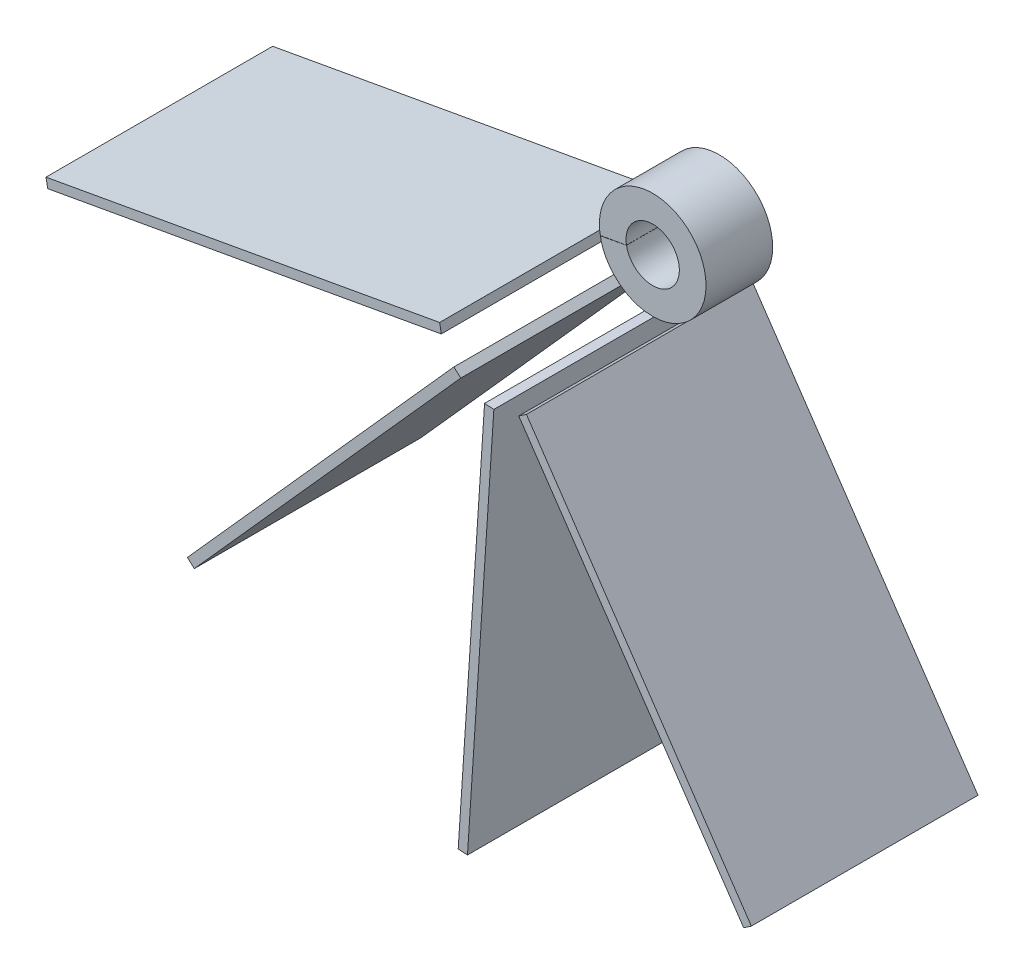
ISO-10303-21;
HEADER;
FILE_DESCRIPTION(('STEP AP214'),'2;1');
FILE_NAME('part.step','',(''),(''),'','','');
FILE_SCHEMA(('AUTOMOTIVE_DESIGN { 1 0 10303 214 1 1 1 1 }'));
ENDSEC;
DATA;
#1=APPLICATION_CONTEXT('core data for automotive mechanical design processes');
#2=APPLICATION_PROTOCOL_DEFINITION('international standard','automotive_design',2000,#1);
#3=PRODUCT_CONTEXT('',#1,'mechanical');
#4=PRODUCT('Part','Part','',(#3));
#5=PRODUCT_RELATED_PRODUCT_CATEGORY('part','',(#4));
#6=PRODUCT_DEFINITION_FORMATION('','',#4);
#7=PRODUCT_DEFINITION_CONTEXT('part definition',#1,'design');
#8=PRODUCT_DEFINITION('design','',#6,#7);
#9=PRODUCT_DEFINITION_SHAPE('','',#8);
#10=(LENGTH_UNIT() NAMED_UNIT(*) SI_UNIT(.MILLI.,.METRE.));
#11=(NAMED_UNIT(*) PLANE_ANGLE_UNIT() SI_UNIT($,.RADIAN.));
#12=(NAMED_UNIT(*) SI_UNIT($,.STERADIAN.) SOLID_ANGLE_UNIT());
#13=UNCERTAINTY_MEASURE_WITH_UNIT(LENGTH_MEASURE(1.E-05),#10,'distance_accuracy_value','');
#14=(GEOMETRIC_REPRESENTATION_CONTEXT(3) GLOBAL_UNCERTAINTY_ASSIGNED_CONTEXT((#13)) GLOBAL_UNIT_ASSIGNED_CONTEXT((#10,
#11,#12)) REPRESENTATION_CONTEXT('',''));
#15=CARTESIAN_POINT('',(0.,0.,0.));
#16=DIRECTION('',(0.,0.,1.));
#17=DIRECTION('',(1.,0.,0.));
#18=AXIS2_PLACEMENT_3D('',#15,#16,#17);
#19=CARTESIAN_POINT('',(0.,0.,25.));
#20=DIRECTION('',(0.,0.,1.));
#21=DIRECTION('',(1.,0.,0.));
#22=AXIS2_PLACEMENT_3D('',#19,#20,#21);
#23=PLANE('',#22);
#24=CARTESIAN_POINT('',(0.,0.,25.));
#25=DIRECTION('',(0.,0.,1.));
#26=DIRECTION('',(1.,0.,0.));
#27=AXIS2_PLACEMENT_3D('',#24,#25,#26);
#28=CIRCLE('',#27,20.);
#29=CARTESIAN_POINT('',(0.425601277281228,-19.9954710760406,25.));
#30=VERTEX_POINT('',#29);
#31=CARTESIAN_POINT('',(9.76308867800203,-17.4551453579014,25.));
#32=VERTEX_POINT('',#31);
#33=EDGE_CURVE('E298',#30,#32,#28,.T.);
#34=ORIENTED_EDGE('',*,*,#33,.T.);
#35=DIRECTION('',(-0.826890700735982,-0.562362666823071,0.));
#36=VECTOR('',#35,1.);
#37=CARTESIAN_POINT('',(9.76308867800203,-17.4551453579014,25.));
#38=LINE('',#37,#36);
#39=CARTESIAN_POINT('',(12.6458196057531,-15.4946199210807,25.));
#40=VERTEX_POINT('',#39);
#41=EDGE_CURVE('E233',#40,#32,#38,.T.);
#42=ORIENTED_EDGE('',*,*,#41,.F.);
#43=CARTESIAN_POINT('',(0.,0.,25.));
#44=DIRECTION('',(0.,0.,1.));
#45=DIRECTION('',(1.,0.,0.));
#46=AXIS2_PLACEMENT_3D('',#43,#44,#45);
#47=CIRCLE('',#46,20.);
#48=CARTESIAN_POINT('',(-19.9079239673436,-1.91691505040434,25.));
#49=VERTEX_POINT('',#48);
#50=EDGE_CURVE('E302',#40,#49,#47,.T.);
#51=ORIENTED_EDGE('',*,*,#50,.T.);
#52=DIRECTION('',(-0.182235525492133,0.983254907563957,0.));
#53=VECTOR('',#52,1.);
#54=CARTESIAN_POINT('',(-19.2726090641725,-5.34476752156502,25.));
#55=LINE('',#54,#53);
#56=CARTESIAN_POINT('',(-19.6080514935224,-3.53488213301206,25.));
#57=VERTEX_POINT('',#56);
#58=EDGE_CURVE('E11',#57,#49,#55,.T.);
#59=ORIENTED_EDGE('',*,*,#58,.F.);
#60=DIRECTION('',(-0.984135746919035,-0.177417112016041,0.));
#61=VECTOR('',#60,1.);
#62=CARTESIAN_POINT('',(0.,0.,25.));
#63=LINE('',#62,#61);
#64=CARTESIAN_POINT('',(-9.84135746919035,-1.77417112016041,25.));
#65=VERTEX_POINT('',#64);
#66=EDGE_CURVE('E316',#65,#57,#63,.T.);
#67=ORIENTED_EDGE('',*,*,#66,.F.);
#68=CARTESIAN_POINT('',(0.,0.,25.));
#69=DIRECTION('',(0.,0.,1.));
#70=DIRECTION('',(1.,0.,0.));
#71=AXIS2_PLACEMENT_3D('',#68,#69,#70);
#72=CIRCLE('',#71,10.);
#73=CARTESIAN_POINT('',(-9.83254907563956,-1.82235525492141,25.));
#74=VERTEX_POINT('',#73);
#75=EDGE_CURVE('E307',#74,#65,#72,.T.);
#76=ORIENTED_EDGE('',*,*,#75,.F.);
#77=DIRECTION('',(-0.983254907563956,-0.182235525492141,0.));
#78=VECTOR('',#77,1.);
#79=CARTESIAN_POINT('',(0.,0.,25.));
#80=LINE('',#79,#78);
#81=CARTESIAN_POINT('',(-19.590266515758,-3.63084128598468,25.));
#82=VERTEX_POINT('',#81);
#83=EDGE_CURVE('E310',#74,#82,#80,.T.);
#84=ORIENTED_EDGE('',*,*,#83,.T.);
#85=CARTESIAN_POINT('',(-19.2726090641725,-5.34476752156502,25.));
#86=VERTEX_POINT('',#85);
#87=EDGE_CURVE('E46',#86,#82,#55,.T.);
#88=ORIENTED_EDGE('',*,*,#87,.F.);
#89=CARTESIAN_POINT('',(0.,0.,25.));
#90=DIRECTION('',(0.,0.,1.));
#91=DIRECTION('',(1.,0.,0.));
#92=AXIS2_PLACEMENT_3D('',#89,#90,#91);
#93=CIRCLE('',#92,20.);
#94=CARTESIAN_POINT('',(-14.5747480224082,-13.6958650724701,25.));
#95=VERTEX_POINT('',#94);
#96=EDGE_CURVE('E304',#86,#95,#93,.T.);
#97=ORIENTED_EDGE('',*,*,#96,.T.);
#98=DIRECTION('',(-0.745701058011383,0.666280670649168,0.));
#99=VECTOR('',#98,1.);
#100=CARTESIAN_POINT('',(-14.5747480224082,-13.6958650724701,25.));
#101=LINE('',#100,#99);
#102=CARTESIAN_POINT('',(-11.9750628392603,-16.0186725416236,25.));
#103=VERTEX_POINT('',#102);
#104=EDGE_CURVE('E260',#103,#95,#101,.T.);
#105=ORIENTED_EDGE('',*,*,#104,.F.);
#106=CARTESIAN_POINT('',(0.,0.,25.));
#107=DIRECTION('',(0.,0.,1.));
#108=DIRECTION('',(1.,0.,0.));
#109=AXIS2_PLACEMENT_3D('',#106,#107,#108);
#110=CIRCLE('',#109,20.);
#111=CARTESIAN_POINT('',(-3.05304167638782,-19.7655998270287,25.));
#112=VERTEX_POINT('',#111);
#113=EDGE_CURVE('E295',#103,#112,#110,.T.);
#114=ORIENTED_EDGE('',*,*,#113,.T.);
#115=DIRECTION('',(-0.997823793361715,0.0659369198646499,0.));
#116=VECTOR('',#115,1.);
#117=CARTESIAN_POINT('',(-3.05304167638782,-19.7655998270287,25.));
#118=LINE('',#117,#116);
#119=EDGE_CURVE('E243',#30,#112,#118,.T.);
#120=ORIENTED_EDGE('',*,*,#119,.F.);
#121=EDGE_LOOP('',(#34,#42,#51,#59,#67,#76,#84,#88,#97,#105,#114,#120));
#122=FACE_BOUND('',#121,.T.);
#123=ADVANCED_FACE('F35',(#122),#23,.T.);
#124=CARTESIAN_POINT('',(0.,0.,25.));
#125=DIRECTION('',(0.,0.,-1.));
#126=DIRECTION('',(-1.,0.,0.));
#127=AXIS2_PLACEMENT_3D('',#124,#125,#126);
#128=CYLINDRICAL_SURFACE('',#127,10.);
#129=CARTESIAN_POINT('',(0.,0.,0.));
#130=DIRECTION('',(0.,0.,1.));
#131=DIRECTION('',(1.,0.,0.));
#132=AXIS2_PLACEMENT_3D('',#129,#130,#131);
#133=CIRCLE('',#132,10.);
#134=CARTESIAN_POINT('',(-9.83254907563956,-1.82235525492141,0.));
#135=VERTEX_POINT('',#134);
#136=CARTESIAN_POINT('',(-9.84135746919035,-1.77417112016041,0.));
#137=VERTEX_POINT('',#136);
#138=EDGE_CURVE('E356',#135,#137,#133,.T.);
#139=ORIENTED_EDGE('',*,*,#138,.F.);
#140=DIRECTION('',(0.,0.,-1.));
#141=VECTOR('',#140,1.);
#142=CARTESIAN_POINT('',(-9.83254907563956,-1.82235525492141,25.));
#143=LINE('',#142,#141);
#144=EDGE_CURVE('E44',#74,#135,#143,.T.);
#145=ORIENTED_EDGE('',*,*,#144,.F.);
#146=ORIENTED_EDGE('',*,*,#75,.T.);
#147=DIRECTION('',(0.,0.,-1.));
#148=VECTOR('',#147,1.);
#149=CARTESIAN_POINT('',(-9.84135746919035,-1.77417112016041,25.));
#150=LINE('',#149,#148);
#151=EDGE_CURVE('E367',#65,#137,#150,.T.);
#152=ORIENTED_EDGE('',*,*,#151,.T.);
#153=EDGE_LOOP('',(#139,#145,#146,#152));
#154=FACE_BOUND('',#153,.T.);
#155=ADVANCED_FACE('F474',(#154),#128,.F.);
#156=CARTESIAN_POINT('',(0.,0.,25.));
#157=DIRECTION('',(0.182235525492141,-0.983254907563956,0.));
#158=DIRECTION('',(0.983254907563956,0.182235525492141,0.));
#159=AXIS2_PLACEMENT_3D('',#156,#157,#158);
#160=PLANE('',#159);
#161=DIRECTION('',(-0.983254907563956,-0.182235525492141,0.));
#162=VECTOR('',#161,1.);
#163=CARTESIAN_POINT('',(0.,0.,0.));
#164=LINE('',#163,#162);
#165=CARTESIAN_POINT('',(-19.6650981512791,-3.64471050984282,0.));
#166=VERTEX_POINT('',#165);
#167=EDGE_CURVE('E359',#135,#166,#164,.T.);
#168=ORIENTED_EDGE('',*,*,#167,.T.);
#169=DIRECTION('',(0.,0.,-1.));
#170=VECTOR('',#169,1.);
#171=CARTESIAN_POINT('',(-19.6650981512791,-3.64471050984282,25.));
#172=LINE('',#171,#170);
#173=CARTESIAN_POINT('',(-19.6650981512791,-3.64471050984282,25.));
#174=VERTEX_POINT('',#173);
#175=EDGE_CURVE('E371',#174,#166,#172,.T.);
#176=ORIENTED_EDGE('',*,*,#175,.F.);
#177=EDGE_CURVE('E60',#82,#174,#80,.T.);
#178=ORIENTED_EDGE('',*,*,#177,.F.);
#179=ORIENTED_EDGE('',*,*,#83,.F.);
#180=ORIENTED_EDGE('',*,*,#144,.T.);
#181=EDGE_LOOP('',(#168,#176,#178,#179,#180));
#182=FACE_BOUND('',#181,.T.);
#183=ADVANCED_FACE('F475',(#182),#160,.F.);
#184=CARTESIAN_POINT('',(0.,0.,25.));
#185=DIRECTION('',(0.,0.,-1.));
#186=DIRECTION('',(-1.,0.,0.));
#187=AXIS2_PLACEMENT_3D('',#184,#185,#186);
#188=CYLINDRICAL_SURFACE('',#187,20.);
#189=CARTESIAN_POINT('',(0.,0.,0.));
#190=DIRECTION('',(0.,0.,1.));
#191=DIRECTION('',(1.,0.,0.));
#192=AXIS2_PLACEMENT_3D('',#189,#190,#191);
#193=CIRCLE('',#192,20.);
#194=CARTESIAN_POINT('',(-19.6827149383807,-3.54834224032083,0.));
#195=VERTEX_POINT('',#194);
#196=EDGE_CURVE('E362',#195,#166,#193,.T.);
#197=ORIENTED_EDGE('',*,*,#196,.F.);
#198=DIRECTION('',(0.,0.,-1.));
#199=VECTOR('',#198,1.);
#200=CARTESIAN_POINT('',(-19.6827149383807,-3.54834224032083,25.));
#201=LINE('',#200,#199);
#202=CARTESIAN_POINT('',(-19.6827149383807,-3.54834224032083,25.));
#203=VERTEX_POINT('',#202);
#204=EDGE_CURVE('E369',#203,#195,#201,.T.);
#205=ORIENTED_EDGE('',*,*,#204,.F.);
#206=CARTESIAN_POINT('',(0.,0.,25.));
#207=DIRECTION('',(0.,0.,1.));
#208=DIRECTION('',(1.,0.,0.));
#209=AXIS2_PLACEMENT_3D('',#206,#207,#208);
#210=CIRCLE('',#209,20.);
#211=EDGE_CURVE('E312',#203,#174,#210,.T.);
#212=ORIENTED_EDGE('',*,*,#211,.T.);
#213=ORIENTED_EDGE('',*,*,#175,.T.);
#214=EDGE_LOOP('',(#197,#205,#212,#213));
#215=FACE_BOUND('',#214,.T.);
#216=ADVANCED_FACE('F469',(#215),#188,.F.);
#217=CARTESIAN_POINT('',(1.29984259157392,-1.16140373457671,25.));
#218=DIRECTION('',(0.745701058011382,-0.666280670649168,0.));
#219=DIRECTION('',(0.666280670649168,0.745701058011382,0.));
#220=AXIS2_PLACEMENT_3D('',#217,#218,#219);
#221=PLANE('',#220);
#222=DIRECTION('',(-0.666280670649168,-0.745701058011382,0.));
#223=VECTOR('',#222,1.);
#224=CARTESIAN_POINT('',(1.29984259157392,-1.16140373457671,0.));
#225=LINE('',#224,#223);
#226=CARTESIAN_POINT('',(-11.9750628392603,-16.0186725416236,0.));
#227=VERTEX_POINT('',#226);
#228=CARTESIAN_POINT('',(-111.917163436636,-127.873831243331,0.));
#229=VERTEX_POINT('',#228);
#230=EDGE_CURVE('E294',#227,#229,#225,.T.);
#231=ORIENTED_EDGE('',*,*,#230,.F.);
#232=DIRECTION('',(0.,0.,-1.));
#233=VECTOR('',#232,1.);
#234=CARTESIAN_POINT('',(-11.9750628392603,-16.0186725416236,25.));
#235=LINE('',#234,#233);
#236=EDGE_CURVE('E39',#103,#227,#235,.T.);
#237=ORIENTED_EDGE('',*,*,#236,.F.);
#238=DIRECTION('',(0.,0.,-1.));
#239=VECTOR('',#238,1.);
#240=CARTESIAN_POINT('',(-11.9750628392603,-16.0186725416236,85.));
#241=LINE('',#240,#239);
#242=CARTESIAN_POINT('',(-11.9750628392603,-16.0186725416236,85.));
#243=VERTEX_POINT('',#242);
#244=EDGE_CURVE('E275',#243,#103,#241,.T.);
#245=ORIENTED_EDGE('',*,*,#244,.F.);
#246=DIRECTION('',(0.666280670649168,0.745701058011382,0.));
#247=VECTOR('',#246,1.);
#248=CARTESIAN_POINT('',(-11.9750628392603,-16.0186725416236,85.));
#249=LINE('',#248,#247);
#250=CARTESIAN_POINT('',(-111.917163436636,-127.873831243331,85.));
#251=VERTEX_POINT('',#250);
#252=EDGE_CURVE('E267',#251,#243,#249,.T.);
#253=ORIENTED_EDGE('',*,*,#252,.F.);
#254=DIRECTION('',(0.,0.,-1.));
#255=VECTOR('',#254,1.);
#256=CARTESIAN_POINT('',(-111.917163436636,-127.873831243331,25.));
#257=LINE('',#256,#255);
#258=EDGE_CURVE('E318',#251,#229,#257,.T.);
#259=ORIENTED_EDGE('',*,*,#258,.T.);
#260=EDGE_LOOP('',(#231,#237,#245,#253,#259));
#261=FACE_BOUND('',#260,.T.);
#262=ADVANCED_FACE('F37',(#261),#221,.T.);
#263=CARTESIAN_POINT('',(0.,0.,25.));
#264=DIRECTION('',(0.,0.,-1.));
#265=DIRECTION('',(-1.,0.,0.));
#266=AXIS2_PLACEMENT_3D('',#263,#264,#265);
#267=CYLINDRICAL_SURFACE('',#266,20.);
#268=CARTESIAN_POINT('',(0.,0.,0.));
#269=DIRECTION('',(0.,0.,1.));
#270=DIRECTION('',(1.,0.,0.));
#271=AXIS2_PLACEMENT_3D('',#268,#269,#270);
#272=CIRCLE('',#271,20.);
#273=CARTESIAN_POINT('',(-3.05304167638782,-19.7655998270287,0.));
#274=VERTEX_POINT('',#273);
#275=EDGE_CURVE('E321',#227,#274,#272,.T.);
#276=ORIENTED_EDGE('',*,*,#275,.T.);
#277=DIRECTION('',(0.,0.,-1.));
#278=VECTOR('',#277,1.);
#279=CARTESIAN_POINT('',(-3.05304167638782,-19.7655998270287,25.));
#280=LINE('',#279,#278);
#281=EDGE_CURVE('E401',#112,#274,#280,.T.);
#282=ORIENTED_EDGE('',*,*,#281,.F.);
#283=ORIENTED_EDGE('',*,*,#113,.F.);
#284=ORIENTED_EDGE('',*,*,#236,.T.);
#285=EDGE_LOOP('',(#276,#282,#283,#284));
#286=FACE_BOUND('',#285,.T.);
#287=ADVANCED_FACE('F410',(#286),#267,.T.);
#288=CARTESIAN_POINT('',(-1.73932147683453,0.114935624505929,25.));
#289=DIRECTION('',(0.997823793361715,-0.0659369198646502,0.));
#290=DIRECTION('',(0.0659369198646502,0.997823793361715,0.));
#291=AXIS2_PLACEMENT_3D('',#288,#289,#290);
#292=PLANE('',#291);
#293=DIRECTION('',(-0.0659369198646502,-0.997823793361715,0.));
#294=VECTOR('',#293,1.);
#295=CARTESIAN_POINT('',(-1.73932147683453,0.114935624505929,0.));
#296=LINE('',#295,#294);
#297=CARTESIAN_POINT('',(-12.9435796560854,-169.439168831286,0.));
#298=VERTEX_POINT('',#297);
#299=EDGE_CURVE('E323',#274,#298,#296,.T.);
#300=ORIENTED_EDGE('',*,*,#299,.T.);
#301=DIRECTION('',(0.,0.,-1.));
#302=VECTOR('',#301,1.);
#303=CARTESIAN_POINT('',(-12.9435796560854,-169.439168831286,25.));
#304=LINE('',#303,#302);
#305=CARTESIAN_POINT('',(-12.9435796560854,-169.439168831286,85.));
#306=VERTEX_POINT('',#305);
#307=EDGE_CURVE('E399',#306,#298,#304,.T.);
#308=ORIENTED_EDGE('',*,*,#307,.F.);
#309=DIRECTION('',(-0.0659369198646502,-0.997823793361715,0.));
#310=VECTOR('',#309,1.);
#311=CARTESIAN_POINT('',(-12.9435796560854,-169.439168831286,85.));
#312=LINE('',#311,#310);
#313=CARTESIAN_POINT('',(-3.05304167638782,-19.7655998270287,85.));
#314=VERTEX_POINT('',#313);
#315=EDGE_CURVE('E244',#314,#306,#312,.T.);
#316=ORIENTED_EDGE('',*,*,#315,.F.);
#317=DIRECTION('',(0.,0.,-1.));
#318=VECTOR('',#317,1.);
#319=CARTESIAN_POINT('',(-3.05304167638782,-19.7655998270287,85.));
#320=LINE('',#319,#318);
#321=EDGE_CURVE('E254',#314,#112,#320,.T.);
#322=ORIENTED_EDGE('',*,*,#321,.T.);
#323=ORIENTED_EDGE('',*,*,#281,.T.);
#324=EDGE_LOOP('',(#300,#308,#316,#322,#323));
#325=FACE_BOUND('',#324,.T.);
#326=ADVANCED_FACE('F532',(#325),#292,.F.);
#327=CARTESIAN_POINT('',(-11.2042581792509,-169.554104455792,25.));
#328=DIRECTION('',(0.0659369198646509,0.997823793361715,0.));
#329=DIRECTION('',(-0.997823793361715,0.0659369198646509,0.));
#330=AXIS2_PLACEMENT_3D('',#327,#328,#329);
#331=PLANE('',#330);
#332=DIRECTION('',(0.997823793361715,-0.0659369198646509,0.));
#333=VECTOR('',#332,1.);
#334=CARTESIAN_POINT('',(-11.2042581792509,-169.554104455792,0.));
#335=LINE('',#334,#333);
#336=CARTESIAN_POINT('',(-9.46493670241631,-169.669040080298,0.));
#337=VERTEX_POINT('',#336);
#338=EDGE_CURVE('E325',#298,#337,#335,.T.);
#339=ORIENTED_EDGE('',*,*,#338,.T.);
#340=DIRECTION('',(0.,0.,-1.));
#341=VECTOR('',#340,1.);
#342=CARTESIAN_POINT('',(-9.46493670241631,-169.669040080298,25.));
#343=LINE('',#342,#341);
#344=CARTESIAN_POINT('',(-9.46493670241631,-169.669040080298,85.));
#345=VERTEX_POINT('',#344);
#346=EDGE_CURVE('E397',#345,#337,#343,.T.);
#347=ORIENTED_EDGE('',*,*,#346,.F.);
#348=DIRECTION('',(0.997823793361715,-0.0659369198646509,0.));
#349=VECTOR('',#348,1.);
#350=CARTESIAN_POINT('',(-9.46493670241631,-169.669040080298,85.));
#351=LINE('',#350,#349);
#352=EDGE_CURVE('E247',#306,#345,#351,.T.);
#353=ORIENTED_EDGE('',*,*,#352,.F.);
#354=ORIENTED_EDGE('',*,*,#307,.T.);
#355=EDGE_LOOP('',(#339,#347,#353,#354));
#356=FACE_BOUND('',#355,.T.);
#357=ADVANCED_FACE('F528',(#356),#331,.F.);
#358=CARTESIAN_POINT('',(1.73932147683452,-0.114935624505928,25.));
#359=DIRECTION('',(0.997823793361715,-0.0659369198646502,0.));
#360=DIRECTION('',(0.0659369198646502,0.997823793361715,0.));
#361=AXIS2_PLACEMENT_3D('',#358,#359,#360);
#362=PLANE('',#361);
#363=DIRECTION('',(-0.0659369198646502,-0.997823793361715,0.));
#364=VECTOR('',#363,1.);
#365=CARTESIAN_POINT('',(1.73932147683452,-0.114935624505928,0.));
#366=LINE('',#365,#364);
#367=CARTESIAN_POINT('',(0.425601277281228,-19.9954710760406,0.));
#368=VERTEX_POINT('',#367);
#369=EDGE_CURVE('E328',#368,#337,#366,.T.);
#370=ORIENTED_EDGE('',*,*,#369,.F.);
#371=DIRECTION('',(0.,0.,-1.));
#372=VECTOR('',#371,1.);
#373=CARTESIAN_POINT('',(0.425601277281228,-19.9954710760406,25.));
#374=LINE('',#373,#372);
#375=EDGE_CURVE('E395',#30,#368,#374,.T.);
#376=ORIENTED_EDGE('',*,*,#375,.F.);
#377=DIRECTION('',(0.,0.,-1.));
#378=VECTOR('',#377,1.);
#379=CARTESIAN_POINT('',(0.425601277281228,-19.9954710760406,85.));
#380=LINE('',#379,#378);
#381=CARTESIAN_POINT('',(0.425601277281228,-19.9954710760406,85.));
#382=VERTEX_POINT('',#381);
#383=EDGE_CURVE('E258',#382,#30,#380,.T.);
#384=ORIENTED_EDGE('',*,*,#383,.F.);
#385=DIRECTION('',(0.0659369198646502,0.997823793361715,0.));
#386=VECTOR('',#385,1.);
#387=CARTESIAN_POINT('',(0.425601277281228,-19.9954710760406,85.));
#388=LINE('',#387,#386);
#389=EDGE_CURVE('E250',#345,#382,#388,.T.);
#390=ORIENTED_EDGE('',*,*,#389,.F.);
#391=ORIENTED_EDGE('',*,*,#346,.T.);
#392=EDGE_LOOP('',(#370,#376,#384,#390,#391));
#393=FACE_BOUND('',#392,.T.);
#394=ADVANCED_FACE('F524',(#393),#362,.T.);
#395=CARTESIAN_POINT('',(0.,0.,25.));
#396=DIRECTION('',(0.,0.,-1.));
#397=DIRECTION('',(-1.,0.,0.));
#398=AXIS2_PLACEMENT_3D('',#395,#396,#397);
#399=CYLINDRICAL_SURFACE('',#398,20.);
#400=CARTESIAN_POINT('',(0.,0.,0.));
#401=DIRECTION('',(0.,0.,1.));
#402=DIRECTION('',(1.,0.,0.));
#403=AXIS2_PLACEMENT_3D('',#400,#401,#402);
#404=CIRCLE('',#403,20.);
#405=CARTESIAN_POINT('',(9.76308867800203,-17.4551453579014,0.));
#406=VERTEX_POINT('',#405);
#407=EDGE_CURVE('E331',#368,#406,#404,.T.);
#408=ORIENTED_EDGE('',*,*,#407,.T.);
#409=DIRECTION('',(0.,0.,-1.));
#410=VECTOR('',#409,1.);
#411=CARTESIAN_POINT('',(9.76308867800203,-17.4551453579014,25.));
#412=LINE('',#411,#410);
#413=EDGE_CURVE('E219',#32,#406,#412,.T.);
#414=ORIENTED_EDGE('',*,*,#413,.F.);
#415=ORIENTED_EDGE('',*,*,#33,.F.);
#416=ORIENTED_EDGE('',*,*,#375,.T.);
#417=EDGE_LOOP('',(#408,#414,#415,#416));
#418=FACE_BOUND('',#417,.T.);
#419=ADVANCED_FACE('F521',(#418),#399,.T.);
#420=CARTESIAN_POINT('',(-1.44136546387552,-0.980262718410367,25.));
#421=DIRECTION('',(0.826890700735983,0.562362666823071,0.));
#422=DIRECTION('',(-0.562362666823071,0.826890700735983,0.));
#423=AXIS2_PLACEMENT_3D('',#420,#421,#422);
#424=PLANE('',#423);
#425=DIRECTION('',(0.562362666823071,-0.826890700735982,0.));
#426=VECTOR('',#425,1.);
#427=CARTESIAN_POINT('',(-1.44136546387552,-0.980262718410367,0.));
#428=LINE('',#427,#426);
#429=CARTESIAN_POINT('',(94.1174887014626,-141.488750468299,0.));
#430=VERTEX_POINT('',#429);
#431=EDGE_CURVE('E215',#406,#430,#428,.T.);
#432=ORIENTED_EDGE('',*,*,#431,.T.);
#433=DIRECTION('',(0.,0.,-1.));
#434=VECTOR('',#433,1.);
#435=CARTESIAN_POINT('',(94.1174887014626,-141.488750468299,25.));
#436=LINE('',#435,#434);
#437=CARTESIAN_POINT('',(94.1174887014626,-141.488750468299,85.));
#438=VERTEX_POINT('',#437);
#439=EDGE_CURVE('E207',#438,#430,#436,.T.);
#440=ORIENTED_EDGE('',*,*,#439,.F.);
#441=DIRECTION('',(0.56236266682307,-0.826890700735982,0.));
#442=VECTOR('',#441,1.);
#443=CARTESIAN_POINT('',(94.1174887014626,-141.488750468299,85.));
#444=LINE('',#443,#442);
#445=CARTESIAN_POINT('',(9.76308867800203,-17.4551453579014,85.));
#446=VERTEX_POINT('',#445);
#447=EDGE_CURVE('E212',#446,#438,#444,.T.);
#448=ORIENTED_EDGE('',*,*,#447,.F.);
#449=DIRECTION('',(0.,0.,-1.));
#450=VECTOR('',#449,1.);
#451=CARTESIAN_POINT('',(9.76308867800203,-17.4551453579014,85.));
#452=LINE('',#451,#450);
#453=EDGE_CURVE('E238',#446,#32,#452,.T.);
#454=ORIENTED_EDGE('',*,*,#453,.T.);
#455=ORIENTED_EDGE('',*,*,#413,.T.);
#456=EDGE_LOOP('',(#432,#440,#448,#454,#455));
#457=FACE_BOUND('',#456,.T.);
#458=ADVANCED_FACE('F209',(#457),#424,.F.);
#459=CARTESIAN_POINT('',(95.5588541653386,-140.508487749888,25.));
#460=DIRECTION('',(-0.562362666823073,0.826890700735981,0.));
#461=DIRECTION('',(-0.826890700735981,-0.562362666823073,0.));
#462=AXIS2_PLACEMENT_3D('',#459,#460,#461);
#463=PLANE('',#462);
#464=DIRECTION('',(0.826890700735981,0.562362666823073,0.));
#465=VECTOR('',#464,1.);
#466=CARTESIAN_POINT('',(95.5588541653386,-140.508487749888,0.));
#467=LINE('',#466,#465);
#468=CARTESIAN_POINT('',(97.0002196292136,-139.528225031478,0.));
#469=VERTEX_POINT('',#468);
#470=EDGE_CURVE('E334',#430,#469,#467,.T.);
#471=ORIENTED_EDGE('',*,*,#470,.T.);
#472=DIRECTION('',(0.,0.,-1.));
#473=VECTOR('',#472,1.);
#474=CARTESIAN_POINT('',(97.0002196292136,-139.528225031478,25.));
#475=LINE('',#474,#473);
#476=CARTESIAN_POINT('',(97.0002196292136,-139.528225031478,85.));
#477=VERTEX_POINT('',#476);
#478=EDGE_CURVE('E220',#477,#469,#475,.T.);
#479=ORIENTED_EDGE('',*,*,#478,.F.);
#480=DIRECTION('',(0.82689070073598,0.562362666823073,0.));
#481=VECTOR('',#480,1.);
#482=CARTESIAN_POINT('',(97.0002196292136,-139.528225031478,85.));
#483=LINE('',#482,#481);
#484=EDGE_CURVE('E223',#438,#477,#483,.T.);
#485=ORIENTED_EDGE('',*,*,#484,.F.);
#486=ORIENTED_EDGE('',*,*,#439,.T.);
#487=EDGE_LOOP('',(#471,#479,#485,#486));
#488=FACE_BOUND('',#487,.T.);
#489=ADVANCED_FACE('F224',(#488),#463,.F.);
#490=CARTESIAN_POINT('',(1.44136546387553,0.980262718410375,25.));
#491=DIRECTION('',(0.826890700735982,0.562362666823071,0.));
#492=DIRECTION('',(-0.562362666823071,0.826890700735983,0.));
#493=AXIS2_PLACEMENT_3D('',#490,#491,#492);
#494=PLANE('',#493);
#495=DIRECTION('',(0.562362666823071,-0.826890700735983,0.));
#496=VECTOR('',#495,1.);
#497=CARTESIAN_POINT('',(1.44136546387553,0.980262718410375,0.));
#498=LINE('',#497,#496);
#499=CARTESIAN_POINT('',(12.6458196057531,-15.4946199210807,0.));
#500=VERTEX_POINT('',#499);
#501=EDGE_CURVE('E336',#500,#469,#498,.T.);
#502=ORIENTED_EDGE('',*,*,#501,.F.);
#503=DIRECTION('',(0.,0.,-1.));
#504=VECTOR('',#503,1.);
#505=CARTESIAN_POINT('',(12.6458196057531,-15.4946199210807,25.));
#506=LINE('',#505,#504);
#507=EDGE_CURVE('E391',#40,#500,#506,.T.);
#508=ORIENTED_EDGE('',*,*,#507,.F.);
#509=DIRECTION('',(0.,0.,-1.));
#510=VECTOR('',#509,1.);
#511=CARTESIAN_POINT('',(12.6458196057531,-15.4946199210807,85.));
#512=LINE('',#511,#510);
#513=CARTESIAN_POINT('',(12.6458196057531,-15.4946199210807,85.));
#514=VERTEX_POINT('',#513);
#515=EDGE_CURVE('E241',#514,#40,#512,.T.);
#516=ORIENTED_EDGE('',*,*,#515,.F.);
#517=DIRECTION('',(-0.562362666823071,0.826890700735982,0.));
#518=VECTOR('',#517,1.);
#519=CARTESIAN_POINT('',(12.6458196057531,-15.4946199210807,85.));
#520=LINE('',#519,#518);
#521=EDGE_CURVE('E227',#477,#514,#520,.T.);
#522=ORIENTED_EDGE('',*,*,#521,.F.);
#523=ORIENTED_EDGE('',*,*,#478,.T.);
#524=EDGE_LOOP('',(#502,#508,#516,#522,#523));
#525=FACE_BOUND('',#524,.T.);
#526=ADVANCED_FACE('F513',(#525),#494,.T.);
#527=CARTESIAN_POINT('',(0.,0.,25.));
#528=DIRECTION('',(0.,0.,-1.));
#529=DIRECTION('',(-1.,0.,0.));
#530=AXIS2_PLACEMENT_3D('',#527,#528,#529);
#531=CYLINDRICAL_SURFACE('',#530,20.);
#532=CARTESIAN_POINT('',(0.,0.,0.));
#533=DIRECTION('',(0.,0.,1.));
#534=DIRECTION('',(1.,0.,0.));
#535=AXIS2_PLACEMENT_3D('',#532,#533,#534);
#536=CIRCLE('',#535,20.);
#537=CARTESIAN_POINT('',(-19.9079239673436,-1.91691505040435,0.));
#538=VERTEX_POINT('',#537);
#539=EDGE_CURVE('E339',#500,#538,#536,.T.);
#540=ORIENTED_EDGE('',*,*,#539,.T.);
#541=DIRECTION('',(0.,0.,-1.));
#542=VECTOR('',#541,1.);
#543=CARTESIAN_POINT('',(-19.9079239673436,-1.91691505040435,25.));
#544=LINE('',#543,#542);
#545=EDGE_CURVE('E388',#49,#538,#544,.T.);
#546=ORIENTED_EDGE('',*,*,#545,.F.);
#547=ORIENTED_EDGE('',*,*,#50,.F.);
#548=ORIENTED_EDGE('',*,*,#507,.T.);
#549=EDGE_LOOP('',(#540,#546,#547,#548));
#550=FACE_BOUND('',#549,.T.);
#551=ADVANCED_FACE('F452',(#550),#531,.T.);
#552=CARTESIAN_POINT('',(-0.291940168588162,1.61939709537828,25.));
#553=DIRECTION('',(0.177417112016041,-0.984135746919035,0.));
#554=DIRECTION('',(0.984135746919035,0.177417112016041,0.));
#555=AXIS2_PLACEMENT_3D('',#552,#553,#554);
#556=PLANE('',#555);
#557=DIRECTION('',(-0.984135746919035,-0.177417112016041,0.));
#558=VECTOR('',#557,1.);
#559=CARTESIAN_POINT('',(-0.291940168588162,1.61939709537828,0.));
#560=LINE('',#559,#558);
#561=CARTESIAN_POINT('',(-167.528286005199,-28.5294818528105,0.));
#562=VERTEX_POINT('',#561);
#563=EDGE_CURVE('E341',#538,#562,#560,.T.);
#564=ORIENTED_EDGE('',*,*,#563,.T.);
#565=DIRECTION('',(0.,0.,-1.));
#566=VECTOR('',#565,1.);
#567=CARTESIAN_POINT('',(-167.528286005199,-28.5294818528105,25.));
#568=LINE('',#567,#566);
#569=CARTESIAN_POINT('',(-167.528286005199,-28.5294818528105,85.));
#570=VERTEX_POINT('',#569);
#571=EDGE_CURVE('E385',#570,#562,#568,.T.);
#572=ORIENTED_EDGE('',*,*,#571,.F.);
#573=DIRECTION('',(-0.984135746919035,-0.177417112016041,0.));
#574=VECTOR('',#573,1.);
#575=CARTESIAN_POINT('',(-19.9079239673436,-1.91691505040434,85.));
#576=LINE('',#575,#574);
#577=CARTESIAN_POINT('',(-19.9079239673436,-1.91691505040434,85.));
#578=VERTEX_POINT('',#577);
#579=EDGE_CURVE('E277',#578,#570,#576,.T.);
#580=ORIENTED_EDGE('',*,*,#579,.F.);
#581=DIRECTION('',(0.,0.,-1.));
#582=VECTOR('',#581,1.);
#583=CARTESIAN_POINT('',(-19.9079239673436,-1.91691505040434,85.));
#584=LINE('',#583,#582);
#585=EDGE_CURVE('E286',#578,#49,#584,.T.);
#586=ORIENTED_EDGE('',*,*,#585,.T.);
#587=ORIENTED_EDGE('',*,*,#545,.T.);
#588=EDGE_LOOP('',(#564,#572,#580,#586,#587));
#589=FACE_BOUND('',#588,.T.);
#590=ADVANCED_FACE('F448',(#589),#556,.F.);
#591=CARTESIAN_POINT('',(-167.07673330873,-30.9658421817194,25.));
#592=DIRECTION('',(0.983254907563956,0.18223552549214,0.));
#593=DIRECTION('',(-0.18223552549214,0.983254907563956,0.));
#594=AXIS2_PLACEMENT_3D('',#591,#592,#593);
#595=PLANE('',#594);
#596=DIRECTION('',(0.18223552549214,-0.983254907563956,0.));
#597=VECTOR('',#596,1.);
#598=CARTESIAN_POINT('',(-167.07673330873,-30.9658421817194,0.));
#599=LINE('',#598,#597);
#600=CARTESIAN_POINT('',(-166.892971102028,-31.9573343239712,0.));
#601=VERTEX_POINT('',#600);
#602=EDGE_CURVE('E343',#562,#601,#599,.T.);
#603=ORIENTED_EDGE('',*,*,#602,.T.);
#604=DIRECTION('',(0.,0.,-1.));
#605=VECTOR('',#604,1.);
#606=CARTESIAN_POINT('',(-166.892971102028,-31.9573343239712,25.));
#607=LINE('',#606,#605);
#608=CARTESIAN_POINT('',(-166.892971102028,-31.9573343239712,85.));
#609=VERTEX_POINT('',#608);
#610=EDGE_CURVE('E383',#609,#601,#607,.T.);
#611=ORIENTED_EDGE('',*,*,#610,.F.);
#612=DIRECTION('',(0.182235525492133,-0.983254907563957,0.));
#613=VECTOR('',#612,1.);
#614=CARTESIAN_POINT('',(-167.528286005199,-28.5294818528105,85.));
#615=LINE('',#614,#613);
#616=EDGE_CURVE('E280',#570,#609,#615,.T.);
#617=ORIENTED_EDGE('',*,*,#616,.F.);
#618=ORIENTED_EDGE('',*,*,#571,.T.);
#619=EDGE_LOOP('',(#603,#611,#617,#618));
#620=FACE_BOUND('',#619,.T.);
#621=ADVANCED_FACE('F444',(#620),#595,.F.);
#622=CARTESIAN_POINT('',(0.326569218335273,-1.81148502506393,25.));
#623=DIRECTION('',(0.177417112016041,-0.984135746919035,0.));
#624=DIRECTION('',(0.984135746919035,0.177417112016041,0.));
#625=AXIS2_PLACEMENT_3D('',#622,#623,#624);
#626=PLANE('',#625);
#627=DIRECTION('',(-0.984135746919035,-0.177417112016041,0.));
#628=VECTOR('',#627,1.);
#629=CARTESIAN_POINT('',(0.326569218335273,-1.81148502506393,0.));
#630=LINE('',#629,#628);
#631=CARTESIAN_POINT('',(-19.2726090641725,-5.34476752156502,0.));
#632=VERTEX_POINT('',#631);
#633=EDGE_CURVE('E346',#632,#601,#630,.T.);
#634=ORIENTED_EDGE('',*,*,#633,.F.);
#635=DIRECTION('',(0.,0.,-1.));
#636=VECTOR('',#635,1.);
#637=CARTESIAN_POINT('',(-19.2726090641725,-5.34476752156502,25.));
#638=LINE('',#637,#636);
#639=EDGE_CURVE('E381',#86,#632,#638,.T.);
#640=ORIENTED_EDGE('',*,*,#639,.F.);
#641=DIRECTION('',(0.,0.,-1.));
#642=VECTOR('',#641,1.);
#643=CARTESIAN_POINT('',(-19.2726090641725,-5.34476752156502,85.));
#644=LINE('',#643,#642);
#645=CARTESIAN_POINT('',(-19.2726090641725,-5.34476752156502,85.));
#646=VERTEX_POINT('',#645);
#647=EDGE_CURVE('E291',#646,#86,#644,.T.);
#648=ORIENTED_EDGE('',*,*,#647,.F.);
#649=DIRECTION('',(0.984135746919035,0.177417112016041,0.));
#650=VECTOR('',#649,1.);
#651=CARTESIAN_POINT('',(-166.892971102028,-31.9573343239712,85.));
#652=LINE('',#651,#650);
#653=EDGE_CURVE('E283',#609,#646,#652,.T.);
#654=ORIENTED_EDGE('',*,*,#653,.F.);
#655=ORIENTED_EDGE('',*,*,#610,.T.);
#656=EDGE_LOOP('',(#634,#640,#648,#654,#655));
#657=FACE_BOUND('',#656,.T.);
#658=ADVANCED_FACE('F437',(#657),#626,.T.);
#659=CARTESIAN_POINT('',(0.,0.,25.));
#660=DIRECTION('',(0.,0.,-1.));
#661=DIRECTION('',(-1.,0.,0.));
#662=AXIS2_PLACEMENT_3D('',#659,#660,#661);
#663=CYLINDRICAL_SURFACE('',#662,20.);
#664=CARTESIAN_POINT('',(0.,0.,0.));
#665=DIRECTION('',(0.,0.,1.));
#666=DIRECTION('',(1.,0.,0.));
#667=AXIS2_PLACEMENT_3D('',#664,#665,#666);
#668=CIRCLE('',#667,20.);
#669=CARTESIAN_POINT('',(-14.5747480224082,-13.6958650724701,0.));
#670=VERTEX_POINT('',#669);
#671=EDGE_CURVE('E349',#632,#670,#668,.T.);
#672=ORIENTED_EDGE('',*,*,#671,.T.);
#673=DIRECTION('',(0.,0.,-1.));
#674=VECTOR('',#673,1.);
#675=CARTESIAN_POINT('',(-14.5747480224082,-13.6958650724701,25.));
#676=LINE('',#675,#674);
#677=EDGE_CURVE('E378',#95,#670,#676,.T.);
#678=ORIENTED_EDGE('',*,*,#677,.F.);
#679=ORIENTED_EDGE('',*,*,#96,.F.);
#680=ORIENTED_EDGE('',*,*,#639,.T.);
#681=EDGE_LOOP('',(#672,#678,#679,#680));
#682=FACE_BOUND('',#681,.T.);
#683=ADVANCED_FACE('F433',(#682),#663,.T.);
#684=CARTESIAN_POINT('',(-1.29984259157394,1.16140373457673,25.));
#685=DIRECTION('',(0.745701058011382,-0.666280670649169,0.));
#686=DIRECTION('',(0.666280670649169,0.745701058011382,0.));
#687=AXIS2_PLACEMENT_3D('',#684,#685,#686);
#688=PLANE('',#687);
#689=DIRECTION('',(-0.666280670649169,-0.745701058011382,0.));
#690=VECTOR('',#689,1.);
#691=CARTESIAN_POINT('',(-1.29984259157394,1.16140373457673,0.));
#692=LINE('',#691,#690);
#693=CARTESIAN_POINT('',(-114.516848619783,-125.551023774177,0.));
#694=VERTEX_POINT('',#693);
#695=EDGE_CURVE('E351',#670,#694,#692,.T.);
#696=ORIENTED_EDGE('',*,*,#695,.T.);
#697=DIRECTION('',(0.,0.,-1.));
#698=VECTOR('',#697,1.);
#699=CARTESIAN_POINT('',(-114.516848619783,-125.551023774177,25.));
#700=LINE('',#699,#698);
#701=CARTESIAN_POINT('',(-114.516848619783,-125.551023774177,85.));
#702=VERTEX_POINT('',#701);
#703=EDGE_CURVE('E375',#702,#694,#700,.T.);
#704=ORIENTED_EDGE('',*,*,#703,.F.);
#705=DIRECTION('',(-0.666280670649169,-0.745701058011382,0.));
#706=VECTOR('',#705,1.);
#707=CARTESIAN_POINT('',(-114.516848619783,-125.551023774177,85.));
#708=LINE('',#707,#706);
#709=CARTESIAN_POINT('',(-14.5747480224082,-13.6958650724701,85.));
#710=VERTEX_POINT('',#709);
#711=EDGE_CURVE('E261',#710,#702,#708,.T.);
#712=ORIENTED_EDGE('',*,*,#711,.F.);
#713=DIRECTION('',(0.,0.,-1.));
#714=VECTOR('',#713,1.);
#715=CARTESIAN_POINT('',(-14.5747480224082,-13.6958650724701,85.));
#716=LINE('',#715,#714);
#717=EDGE_CURVE('E271',#710,#95,#716,.T.);
#718=ORIENTED_EDGE('',*,*,#717,.T.);
#719=ORIENTED_EDGE('',*,*,#677,.T.);
#720=EDGE_LOOP('',(#696,#704,#712,#718,#719));
#721=FACE_BOUND('',#720,.T.);
#722=ADVANCED_FACE('F427',(#721),#688,.F.);
#723=CARTESIAN_POINT('',(-113.217006028211,-126.712427508753,25.));
#724=DIRECTION('',(0.666280670649176,0.745701058011375,0.));
#725=DIRECTION('',(-0.745701058011375,0.666280670649176,0.));
#726=AXIS2_PLACEMENT_3D('',#723,#724,#725);
#727=PLANE('',#726);
#728=DIRECTION('',(0.745701058011375,-0.666280670649176,0.));
#729=VECTOR('',#728,1.);
#730=CARTESIAN_POINT('',(-113.217006028211,-126.712427508753,0.));
#731=LINE('',#730,#729);
#732=EDGE_CURVE('E353',#694,#229,#731,.T.);
#733=ORIENTED_EDGE('',*,*,#732,.T.);
#734=ORIENTED_EDGE('',*,*,#258,.F.);
#735=DIRECTION('',(0.745701058011375,-0.666280670649176,0.));
#736=VECTOR('',#735,1.);
#737=CARTESIAN_POINT('',(-111.917163436636,-127.873831243331,85.));
#738=LINE('',#737,#736);
#739=EDGE_CURVE('E264',#702,#251,#738,.T.);
#740=ORIENTED_EDGE('',*,*,#739,.F.);
#741=ORIENTED_EDGE('',*,*,#703,.T.);
#742=EDGE_LOOP('',(#733,#734,#740,#741));
#743=FACE_BOUND('',#742,.T.);
#744=ADVANCED_FACE('F422',(#743),#727,.F.);
#745=CARTESIAN_POINT('',(0.,0.,25.));
#746=DIRECTION('',(0.177417112016041,-0.984135746919035,0.));
#747=DIRECTION('',(0.984135746919035,0.177417112016041,0.));
#748=AXIS2_PLACEMENT_3D('',#745,#746,#747);
#749=PLANE('',#748);
#750=DIRECTION('',(-0.984135746919035,-0.177417112016041,0.));
#751=VECTOR('',#750,1.);
#752=CARTESIAN_POINT('',(0.,0.,0.));
#753=LINE('',#752,#751);
#754=EDGE_CURVE('E299',#137,#195,#753,.T.);
#755=ORIENTED_EDGE('',*,*,#754,.F.);
#756=ORIENTED_EDGE('',*,*,#151,.F.);
#757=ORIENTED_EDGE('',*,*,#66,.T.);
#758=EDGE_CURVE('E315',#57,#203,#63,.T.);
#759=ORIENTED_EDGE('',*,*,#758,.T.);
#760=ORIENTED_EDGE('',*,*,#204,.T.);
#761=EDGE_LOOP('',(#755,#756,#757,#759,#760));
#762=FACE_BOUND('',#761,.T.);
#763=ADVANCED_FACE('F466',(#762),#749,.T.);
#764=CARTESIAN_POINT('',(0.,0.,0.));
#765=DIRECTION('',(0.,0.,1.));
#766=DIRECTION('',(1.,0.,0.));
#767=AXIS2_PLACEMENT_3D('',#764,#765,#766);
#768=PLANE('',#767);
#769=ORIENTED_EDGE('',*,*,#230,.T.);
#770=ORIENTED_EDGE('',*,*,#732,.F.);
#771=ORIENTED_EDGE('',*,*,#695,.F.);
#772=ORIENTED_EDGE('',*,*,#671,.F.);
#773=ORIENTED_EDGE('',*,*,#633,.T.);
#774=ORIENTED_EDGE('',*,*,#602,.F.);
#775=ORIENTED_EDGE('',*,*,#563,.F.);
#776=ORIENTED_EDGE('',*,*,#539,.F.);
#777=ORIENTED_EDGE('',*,*,#501,.T.);
#778=ORIENTED_EDGE('',*,*,#470,.F.);
#779=ORIENTED_EDGE('',*,*,#431,.F.);
#780=ORIENTED_EDGE('',*,*,#407,.F.);
#781=ORIENTED_EDGE('',*,*,#369,.T.);
#782=ORIENTED_EDGE('',*,*,#338,.F.);
#783=ORIENTED_EDGE('',*,*,#299,.F.);
#784=ORIENTED_EDGE('',*,*,#275,.F.);
#785=EDGE_LOOP('',(#769,#770,#771,#772,#773,#774,#775,#776,#777,#778,#779,#780,#781,#782,#783,#784));
#786=FACE_BOUND('',#785,.T.);
#787=ORIENTED_EDGE('',*,*,#138,.T.);
#788=ORIENTED_EDGE('',*,*,#754,.T.);
#789=ORIENTED_EDGE('',*,*,#196,.T.);
#790=ORIENTED_EDGE('',*,*,#167,.F.);
#791=EDGE_LOOP('',(#787,#788,#789,#790));
#792=FACE_BOUND('',#791,.T.);
#793=ADVANCED_FACE('F415',(#786,#792),#768,.F.);
#794=CARTESIAN_POINT('',(0.,0.,25.));
#795=DIRECTION('',(0.,0.,1.));
#796=DIRECTION('',(1.,0.,0.));
#797=AXIS2_PLACEMENT_3D('',#794,#795,#796);
#798=PLANE('',#797);
#799=EDGE_CURVE('E47',#82,#57,#55,.T.);
#800=ORIENTED_EDGE('',*,*,#799,.F.);
#801=ORIENTED_EDGE('',*,*,#177,.T.);
#802=ORIENTED_EDGE('',*,*,#211,.F.);
#803=ORIENTED_EDGE('',*,*,#758,.F.);
#804=EDGE_LOOP('',(#800,#801,#802,#803));
#805=FACE_BOUND('',#804,.T.);
#806=ADVANCED_FACE('F461',(#805),#798,.F.);
#807=CARTESIAN_POINT('',(-19.2726090641725,-5.34476752156502,85.));
#808=DIRECTION('',(-0.983254907563957,-0.182235525492133,0.));
#809=DIRECTION('',(0.182235525492133,-0.983254907563957,0.));
#810=AXIS2_PLACEMENT_3D('',#807,#808,#809);
#811=PLANE('',#810);
#812=ORIENTED_EDGE('',*,*,#87,.T.);
#813=ORIENTED_EDGE('',*,*,#799,.T.);
#814=ORIENTED_EDGE('',*,*,#58,.T.);
#815=ORIENTED_EDGE('',*,*,#585,.F.);
#816=DIRECTION('',(-0.182235525492133,0.983254907563957,0.));
#817=VECTOR('',#816,1.);
#818=CARTESIAN_POINT('',(-19.2726090641725,-5.34476752156502,85.));
#819=LINE('',#818,#817);
#820=EDGE_CURVE('E285',#646,#578,#819,.T.);
#821=ORIENTED_EDGE('',*,*,#820,.F.);
#822=ORIENTED_EDGE('',*,*,#647,.T.);
#823=EDGE_LOOP('',(#812,#813,#814,#815,#821,#822));
#824=FACE_BOUND('',#823,.T.);
#825=ADVANCED_FACE('F457',(#824),#811,.F.);
#826=CARTESIAN_POINT('',(0.,0.,85.));
#827=DIRECTION('',(0.,0.,1.));
#828=DIRECTION('',(1.,0.,0.));
#829=AXIS2_PLACEMENT_3D('',#826,#827,#828);
#830=PLANE('',#829);
#831=ORIENTED_EDGE('',*,*,#579,.T.);
#832=ORIENTED_EDGE('',*,*,#616,.T.);
#833=ORIENTED_EDGE('',*,*,#653,.T.);
#834=ORIENTED_EDGE('',*,*,#820,.T.);
#835=EDGE_LOOP('',(#831,#832,#833,#834));
#836=FACE_BOUND('',#835,.T.);
#837=ADVANCED_FACE('F582',(#836),#830,.T.);
#838=CARTESIAN_POINT('',(-14.5747480224082,-13.6958650724701,85.));
#839=DIRECTION('',(-0.666280670649168,-0.745701058011383,0.));
#840=DIRECTION('',(0.745701058011383,-0.666280670649168,0.));
#841=AXIS2_PLACEMENT_3D('',#838,#839,#840);
#842=PLANE('',#841);
#843=ORIENTED_EDGE('',*,*,#104,.T.);
#844=ORIENTED_EDGE('',*,*,#717,.F.);
#845=DIRECTION('',(-0.745701058011383,0.666280670649168,0.));
#846=VECTOR('',#845,1.);
#847=CARTESIAN_POINT('',(-14.5747480224082,-13.6958650724701,85.));
#848=LINE('',#847,#846);
#849=EDGE_CURVE('E269',#243,#710,#848,.T.);
#850=ORIENTED_EDGE('',*,*,#849,.F.);
#851=ORIENTED_EDGE('',*,*,#244,.T.);
#852=EDGE_LOOP('',(#843,#844,#850,#851));
#853=FACE_BOUND('',#852,.T.);
#854=ADVANCED_FACE('F588',(#853),#842,.F.);
#855=CARTESIAN_POINT('',(0.,0.,85.));
#856=DIRECTION('',(0.,0.,-1.));
#857=DIRECTION('',(-1.,0.,0.));
#858=AXIS2_PLACEMENT_3D('',#855,#856,#857);
#859=PLANE('',#858);
#860=ORIENTED_EDGE('',*,*,#711,.T.);
#861=ORIENTED_EDGE('',*,*,#739,.T.);
#862=ORIENTED_EDGE('',*,*,#252,.T.);
#863=ORIENTED_EDGE('',*,*,#849,.T.);
#864=EDGE_LOOP('',(#860,#861,#862,#863));
#865=FACE_BOUND('',#864,.T.);
#866=ADVANCED_FACE('F596',(#865),#859,.F.);
#867=CARTESIAN_POINT('',(-3.05304167638782,-19.7655998270287,85.));
#868=DIRECTION('',(-0.0659369198646499,-0.997823793361715,0.));
#869=DIRECTION('',(0.997823793361715,-0.0659369198646499,0.));
#870=AXIS2_PLACEMENT_3D('',#867,#868,#869);
#871=PLANE('',#870);
#872=ORIENTED_EDGE('',*,*,#119,.T.);
#873=ORIENTED_EDGE('',*,*,#321,.F.);
#874=DIRECTION('',(-0.997823793361715,0.0659369198646499,0.));
#875=VECTOR('',#874,1.);
#876=CARTESIAN_POINT('',(-3.05304167638782,-19.7655998270287,85.));
#877=LINE('',#876,#875);
#878=EDGE_CURVE('E252',#382,#314,#877,.T.);
#879=ORIENTED_EDGE('',*,*,#878,.F.);
#880=ORIENTED_EDGE('',*,*,#383,.T.);
#881=EDGE_LOOP('',(#872,#873,#879,#880));
#882=FACE_BOUND('',#881,.T.);
#883=ADVANCED_FACE('F604',(#882),#871,.F.);
#884=CARTESIAN_POINT('',(0.,0.,85.));
#885=DIRECTION('',(0.,0.,-1.));
#886=DIRECTION('',(-1.,0.,0.));
#887=AXIS2_PLACEMENT_3D('',#884,#885,#886);
#888=PLANE('',#887);
#889=ORIENTED_EDGE('',*,*,#315,.T.);
#890=ORIENTED_EDGE('',*,*,#352,.T.);
#891=ORIENTED_EDGE('',*,*,#389,.T.);
#892=ORIENTED_EDGE('',*,*,#878,.T.);
#893=EDGE_LOOP('',(#889,#890,#891,#892));
#894=FACE_BOUND('',#893,.T.);
#895=ADVANCED_FACE('F612',(#894),#888,.F.);
#896=CARTESIAN_POINT('',(9.76308867800203,-17.4551453579014,85.));
#897=DIRECTION('',(0.562362666823071,-0.826890700735982,0.));
#898=DIRECTION('',(0.826890700735982,0.562362666823071,0.));
#899=AXIS2_PLACEMENT_3D('',#896,#897,#898);
#900=PLANE('',#899);
#901=ORIENTED_EDGE('',*,*,#41,.T.);
#902=ORIENTED_EDGE('',*,*,#453,.F.);
#903=DIRECTION('',(-0.826890700735982,-0.562362666823071,0.));
#904=VECTOR('',#903,1.);
#905=CARTESIAN_POINT('',(9.76308867800203,-17.4551453579014,85.));
#906=LINE('',#905,#904);
#907=EDGE_CURVE('E231',#514,#446,#906,.T.);
#908=ORIENTED_EDGE('',*,*,#907,.F.);
#909=ORIENTED_EDGE('',*,*,#515,.T.);
#910=EDGE_LOOP('',(#901,#902,#908,#909));
#911=FACE_BOUND('',#910,.T.);
#912=ADVANCED_FACE('F620',(#911),#900,.F.);
#913=CARTESIAN_POINT('',(0.,0.,85.));
#914=DIRECTION('',(0.,0.,-1.));
#915=DIRECTION('',(-1.,0.,0.));
#916=AXIS2_PLACEMENT_3D('',#913,#914,#915);
#917=PLANE('',#916);
#918=ORIENTED_EDGE('',*,*,#447,.T.);
#919=ORIENTED_EDGE('',*,*,#484,.T.);
#920=ORIENTED_EDGE('',*,*,#521,.T.);
#921=ORIENTED_EDGE('',*,*,#907,.T.);
#922=EDGE_LOOP('',(#918,#919,#920,#921));
#923=FACE_BOUND('',#922,.T.);
#924=ADVANCED_FACE('F229',(#923),#917,.F.);
#925=CLOSED_SHELL('',(#123,#155,#183,#216,#262,#287,#326,#357,#394,#419,#458,#489,#526,#551,
#590,#621,#658,#683,#722,#744,#763,#793,#806,#825,#837,#854,#866,#883,#895,#912,#924));
#926=MANIFOLD_SOLID_BREP('B2',#925);
#927=ADVANCED_BREP_SHAPE_REPRESENTATION('',(#18,#926),#14);
#928=SHAPE_DEFINITION_REPRESENTATION(#9,#927);
ENDSEC;
END-ISO-10303-21;
